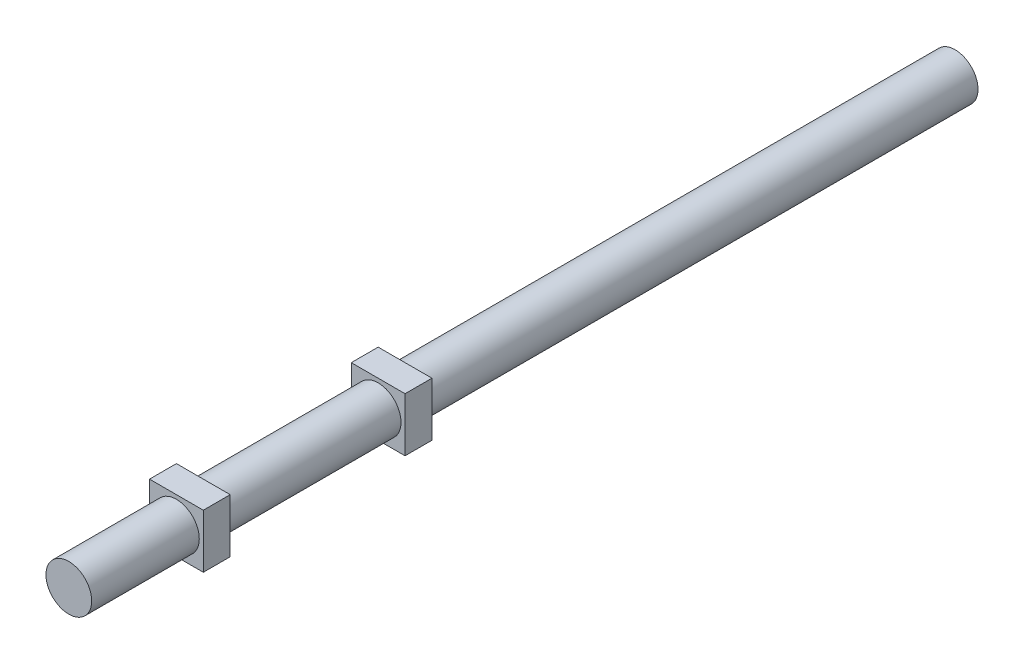
ISO-10303-21;
HEADER;
FILE_DESCRIPTION(('STEP AP214'),'2;1');
FILE_NAME('part.step','',(''),(''),'','','');
FILE_SCHEMA(('AUTOMOTIVE_DESIGN { 1 0 10303 214 1 1 1 1 }'));
ENDSEC;
DATA;
#1=APPLICATION_CONTEXT('core data for automotive mechanical design processes');
#2=APPLICATION_PROTOCOL_DEFINITION('international standard','automotive_design',2000,#1);
#3=PRODUCT_CONTEXT('',#1,'mechanical');
#4=PRODUCT('Part','Part','',(#3));
#5=PRODUCT_RELATED_PRODUCT_CATEGORY('part','',(#4));
#6=PRODUCT_DEFINITION_FORMATION('','',#4);
#7=PRODUCT_DEFINITION_CONTEXT('part definition',#1,'design');
#8=PRODUCT_DEFINITION('design','',#6,#7);
#9=PRODUCT_DEFINITION_SHAPE('','',#8);
#10=(LENGTH_UNIT() NAMED_UNIT(*) SI_UNIT(.MILLI.,.METRE.));
#11=(NAMED_UNIT(*) PLANE_ANGLE_UNIT() SI_UNIT($,.RADIAN.));
#12=(NAMED_UNIT(*) SI_UNIT($,.STERADIAN.) SOLID_ANGLE_UNIT());
#13=UNCERTAINTY_MEASURE_WITH_UNIT(LENGTH_MEASURE(1.E-05),#10,'distance_accuracy_value','');
#14=(GEOMETRIC_REPRESENTATION_CONTEXT(3) GLOBAL_UNCERTAINTY_ASSIGNED_CONTEXT((#13)) GLOBAL_UNIT_ASSIGNED_CONTEXT((#10,
#11,#12)) REPRESENTATION_CONTEXT('',''));
#15=CARTESIAN_POINT('',(0.,0.,0.));
#16=DIRECTION('',(0.,0.,1.));
#17=DIRECTION('',(1.,0.,0.));
#18=AXIS2_PLACEMENT_3D('',#15,#16,#17);
#19=CARTESIAN_POINT('',(0.,0.,329.5));
#20=DIRECTION('',(0.,0.,-1.));
#21=DIRECTION('',(-1.,0.,0.));
#22=AXIS2_PLACEMENT_3D('',#19,#20,#21);
#23=CYLINDRICAL_SURFACE('',#22,8.5);
#24=CARTESIAN_POINT('',(0.,0.,289.5));
#25=DIRECTION('',(0.,0.,1.));
#26=DIRECTION('',(1.,0.,0.));
#27=AXIS2_PLACEMENT_3D('',#24,#25,#26);
#28=CIRCLE('',#27,8.5);
#29=CARTESIAN_POINT('',(8.5,0.,289.5));
#30=VERTEX_POINT('',#29);
#31=EDGE_CURVE('E175',#30,#30,#28,.T.);
#32=ORIENTED_EDGE('',*,*,#31,.T.);
#33=EDGE_LOOP('',(#32));
#34=FACE_BOUND('',#33,.T.);
#35=CARTESIAN_POINT('',(0.,0.,329.5));
#36=DIRECTION('',(0.,0.,1.));
#37=DIRECTION('',(1.,0.,0.));
#38=AXIS2_PLACEMENT_3D('',#35,#36,#37);
#39=CIRCLE('',#38,8.5);
#40=CARTESIAN_POINT('',(8.5,0.,329.5));
#41=VERTEX_POINT('',#40);
#42=EDGE_CURVE('E176',#41,#41,#39,.T.);
#43=ORIENTED_EDGE('',*,*,#42,.F.);
#44=EDGE_LOOP('',(#43));
#45=FACE_BOUND('',#44,.T.);
#46=ADVANCED_FACE('F47',(#34,#45),#23,.T.);
#47=CARTESIAN_POINT('',(0.,0.,329.5));
#48=DIRECTION('',(0.,0.,1.));
#49=DIRECTION('',(1.,0.,0.));
#50=AXIS2_PLACEMENT_3D('',#47,#48,#49);
#51=PLANE('',#50);
#52=ORIENTED_EDGE('',*,*,#42,.T.);
#53=EDGE_LOOP('',(#52));
#54=FACE_BOUND('',#53,.T.);
#55=ADVANCED_FACE('F215',(#54),#51,.T.);
#56=CARTESIAN_POINT('',(10.,10.,289.5));
#57=DIRECTION('',(-1.,0.,0.));
#58=DIRECTION('',(0.,0.,1.));
#59=AXIS2_PLACEMENT_3D('',#56,#57,#58);
#60=PLANE('',#59);
#61=DIRECTION('',(0.,1.,0.));
#62=VECTOR('',#61,1.);
#63=CARTESIAN_POINT('',(10.,10.,279.5));
#64=LINE('',#63,#62);
#65=CARTESIAN_POINT('',(10.,-10.,279.5));
#66=VERTEX_POINT('',#65);
#67=CARTESIAN_POINT('',(10.,10.,279.5));
#68=VERTEX_POINT('',#67);
#69=EDGE_CURVE('E150',#66,#68,#64,.T.);
#70=ORIENTED_EDGE('',*,*,#69,.T.);
#71=DIRECTION('',(0.,0.,-1.));
#72=VECTOR('',#71,1.);
#73=CARTESIAN_POINT('',(10.,10.,289.5));
#74=LINE('',#73,#72);
#75=CARTESIAN_POINT('',(10.,10.,289.5));
#76=VERTEX_POINT('',#75);
#77=EDGE_CURVE('E173',#76,#68,#74,.T.);
#78=ORIENTED_EDGE('',*,*,#77,.F.);
#79=DIRECTION('',(0.,1.,0.));
#80=VECTOR('',#79,1.);
#81=CARTESIAN_POINT('',(10.,10.,289.5));
#82=LINE('',#81,#80);
#83=CARTESIAN_POINT('',(10.,-10.,289.5));
#84=VERTEX_POINT('',#83);
#85=EDGE_CURVE('E155',#84,#76,#82,.T.);
#86=ORIENTED_EDGE('',*,*,#85,.F.);
#87=DIRECTION('',(0.,0.,-1.));
#88=VECTOR('',#87,1.);
#89=CARTESIAN_POINT('',(10.,-10.,289.5));
#90=LINE('',#89,#88);
#91=EDGE_CURVE('E161',#84,#66,#90,.T.);
#92=ORIENTED_EDGE('',*,*,#91,.T.);
#93=EDGE_LOOP('',(#70,#78,#86,#92));
#94=FACE_BOUND('',#93,.T.);
#95=ADVANCED_FACE('F197',(#94),#60,.F.);
#96=CARTESIAN_POINT('',(-10.,10.,289.5));
#97=DIRECTION('',(0.,-1.,0.));
#98=DIRECTION('',(0.,0.,-1.));
#99=AXIS2_PLACEMENT_3D('',#96,#97,#98);
#100=PLANE('',#99);
#101=DIRECTION('',(-1.,0.,0.));
#102=VECTOR('',#101,1.);
#103=CARTESIAN_POINT('',(-10.,10.,279.5));
#104=LINE('',#103,#102);
#105=CARTESIAN_POINT('',(-10.,10.,279.5));
#106=VERTEX_POINT('',#105);
#107=EDGE_CURVE('E164',#68,#106,#104,.T.);
#108=ORIENTED_EDGE('',*,*,#107,.T.);
#109=DIRECTION('',(0.,0.,-1.));
#110=VECTOR('',#109,1.);
#111=CARTESIAN_POINT('',(-10.,10.,289.5));
#112=LINE('',#111,#110);
#113=CARTESIAN_POINT('',(-10.,10.,289.5));
#114=VERTEX_POINT('',#113);
#115=EDGE_CURVE('E171',#114,#106,#112,.T.);
#116=ORIENTED_EDGE('',*,*,#115,.F.);
#117=DIRECTION('',(-1.,0.,0.));
#118=VECTOR('',#117,1.);
#119=CARTESIAN_POINT('',(-10.,10.,289.5));
#120=LINE('',#119,#118);
#121=EDGE_CURVE('E96',#76,#114,#120,.T.);
#122=ORIENTED_EDGE('',*,*,#121,.F.);
#123=ORIENTED_EDGE('',*,*,#77,.T.);
#124=EDGE_LOOP('',(#108,#116,#122,#123));
#125=FACE_BOUND('',#124,.T.);
#126=ADVANCED_FACE('F199',(#125),#100,.F.);
#127=CARTESIAN_POINT('',(-10.,10.,289.5));
#128=DIRECTION('',(1.,0.,0.));
#129=DIRECTION('',(0.,1.,0.));
#130=AXIS2_PLACEMENT_3D('',#127,#128,#129);
#131=PLANE('',#130);
#132=DIRECTION('',(0.,-1.,0.));
#133=VECTOR('',#132,1.);
#134=CARTESIAN_POINT('',(-10.,10.,279.5));
#135=LINE('',#134,#133);
#136=CARTESIAN_POINT('',(-10.,-10.,279.5));
#137=VERTEX_POINT('',#136);
#138=EDGE_CURVE('E82',#106,#137,#135,.T.);
#139=ORIENTED_EDGE('',*,*,#138,.T.);
#140=DIRECTION('',(0.,0.,-1.));
#141=VECTOR('',#140,1.);
#142=CARTESIAN_POINT('',(-10.,-10.,289.5));
#143=LINE('',#142,#141);
#144=CARTESIAN_POINT('',(-10.,-10.,289.5));
#145=VERTEX_POINT('',#144);
#146=EDGE_CURVE('E169',#145,#137,#143,.T.);
#147=ORIENTED_EDGE('',*,*,#146,.F.);
#148=DIRECTION('',(0.,-1.,0.));
#149=VECTOR('',#148,1.);
#150=CARTESIAN_POINT('',(-10.,10.,289.5));
#151=LINE('',#150,#149);
#152=EDGE_CURVE('E158',#114,#145,#151,.T.);
#153=ORIENTED_EDGE('',*,*,#152,.F.);
#154=ORIENTED_EDGE('',*,*,#115,.T.);
#155=EDGE_LOOP('',(#139,#147,#153,#154));
#156=FACE_BOUND('',#155,.T.);
#157=ADVANCED_FACE('F202',(#156),#131,.F.);
#158=CARTESIAN_POINT('',(-10.,-10.,289.5));
#159=DIRECTION('',(0.,1.,0.));
#160=DIRECTION('',(0.,0.,1.));
#161=AXIS2_PLACEMENT_3D('',#158,#159,#160);
#162=PLANE('',#161);
#163=DIRECTION('',(1.,0.,0.));
#164=VECTOR('',#163,1.);
#165=CARTESIAN_POINT('',(-10.,-10.,279.5));
#166=LINE('',#165,#164);
#167=EDGE_CURVE('E88',#137,#66,#166,.T.);
#168=ORIENTED_EDGE('',*,*,#167,.T.);
#169=ORIENTED_EDGE('',*,*,#91,.F.);
#170=DIRECTION('',(1.,0.,0.));
#171=VECTOR('',#170,1.);
#172=CARTESIAN_POINT('',(-10.,-10.,289.5));
#173=LINE('',#172,#171);
#174=EDGE_CURVE('E64',#145,#84,#173,.T.);
#175=ORIENTED_EDGE('',*,*,#174,.F.);
#176=ORIENTED_EDGE('',*,*,#146,.T.);
#177=EDGE_LOOP('',(#168,#169,#175,#176));
#178=FACE_BOUND('',#177,.T.);
#179=ADVANCED_FACE('F192',(#178),#162,.F.);
#180=CARTESIAN_POINT('',(0.,0.,289.5));
#181=DIRECTION('',(0.,0.,1.));
#182=DIRECTION('',(1.,0.,0.));
#183=AXIS2_PLACEMENT_3D('',#180,#181,#182);
#184=PLANE('',#183);
#185=ORIENTED_EDGE('',*,*,#31,.F.);
#186=EDGE_LOOP('',(#185));
#187=FACE_BOUND('',#186,.T.);
#188=ORIENTED_EDGE('',*,*,#85,.T.);
#189=ORIENTED_EDGE('',*,*,#121,.T.);
#190=ORIENTED_EDGE('',*,*,#152,.T.);
#191=ORIENTED_EDGE('',*,*,#174,.T.);
#192=EDGE_LOOP('',(#188,#189,#190,#191));
#193=FACE_BOUND('',#192,.T.);
#194=ADVANCED_FACE('F189',(#187,#193),#184,.T.);
#195=CARTESIAN_POINT('',(0.,0.,279.5));
#196=DIRECTION('',(0.,0.,1.));
#197=DIRECTION('',(1.,0.,0.));
#198=AXIS2_PLACEMENT_3D('',#195,#196,#197);
#199=PLANE('',#198);
#200=CARTESIAN_POINT('',(0.,0.,279.5));
#201=DIRECTION('',(0.,0.,1.));
#202=DIRECTION('',(1.,0.,0.));
#203=AXIS2_PLACEMENT_3D('',#200,#201,#202);
#204=CIRCLE('',#203,8.5);
#205=CARTESIAN_POINT('',(8.5,0.,279.5));
#206=VERTEX_POINT('',#205);
#207=EDGE_CURVE('E56',#206,#206,#204,.T.);
#208=ORIENTED_EDGE('',*,*,#207,.T.);
#209=EDGE_LOOP('',(#208));
#210=FACE_BOUND('',#209,.T.);
#211=ORIENTED_EDGE('',*,*,#69,.F.);
#212=ORIENTED_EDGE('',*,*,#167,.F.);
#213=ORIENTED_EDGE('',*,*,#138,.F.);
#214=ORIENTED_EDGE('',*,*,#107,.F.);
#215=EDGE_LOOP('',(#211,#212,#213,#214));
#216=FACE_BOUND('',#215,.T.);
#217=ADVANCED_FACE('F191',(#210,#216),#199,.F.);
#218=CARTESIAN_POINT('',(0.,0.,214.5));
#219=DIRECTION('',(0.,0.,1.));
#220=DIRECTION('',(1.,0.,0.));
#221=AXIS2_PLACEMENT_3D('',#218,#219,#220);
#222=CIRCLE('',#221,8.5);
#223=CARTESIAN_POINT('',(8.5,0.,214.5));
#224=VERTEX_POINT('',#223);
#225=EDGE_CURVE('E50',#224,#224,#222,.T.);
#226=ORIENTED_EDGE('',*,*,#225,.T.);
#227=EDGE_LOOP('',(#226));
#228=FACE_BOUND('',#227,.T.);
#229=ORIENTED_EDGE('',*,*,#207,.F.);
#230=EDGE_LOOP('',(#229));
#231=FACE_BOUND('',#230,.T.);
#232=ADVANCED_FACE('F204',(#228,#231),#23,.T.);
#233=CARTESIAN_POINT('',(10.,10.,214.5));
#234=DIRECTION('',(-1.,0.,0.));
#235=DIRECTION('',(0.,0.,1.));
#236=AXIS2_PLACEMENT_3D('',#233,#234,#235);
#237=PLANE('',#236);
#238=DIRECTION('',(0.,1.,0.));
#239=VECTOR('',#238,1.);
#240=CARTESIAN_POINT('',(10.,10.,204.5));
#241=LINE('',#240,#239);
#242=CARTESIAN_POINT('',(10.,-10.,204.5));
#243=VERTEX_POINT('',#242);
#244=CARTESIAN_POINT('',(10.,10.,204.5));
#245=VERTEX_POINT('',#244);
#246=EDGE_CURVE('E147',#243,#245,#241,.T.);
#247=ORIENTED_EDGE('',*,*,#246,.T.);
#248=DIRECTION('',(0.,0.,-1.));
#249=VECTOR('',#248,1.);
#250=CARTESIAN_POINT('',(10.,10.,214.5));
#251=LINE('',#250,#249);
#252=CARTESIAN_POINT('',(10.,10.,214.5));
#253=VERTEX_POINT('',#252);
#254=EDGE_CURVE('E127',#253,#245,#251,.T.);
#255=ORIENTED_EDGE('',*,*,#254,.F.);
#256=DIRECTION('',(0.,1.,0.));
#257=VECTOR('',#256,1.);
#258=CARTESIAN_POINT('',(10.,10.,214.5));
#259=LINE('',#258,#257);
#260=CARTESIAN_POINT('',(10.,-10.,214.5));
#261=VERTEX_POINT('',#260);
#262=EDGE_CURVE('E134',#261,#253,#259,.T.);
#263=ORIENTED_EDGE('',*,*,#262,.F.);
#264=DIRECTION('',(0.,0.,-1.));
#265=VECTOR('',#264,1.);
#266=CARTESIAN_POINT('',(10.,-10.,214.5));
#267=LINE('',#266,#265);
#268=EDGE_CURVE('E249',#261,#243,#267,.T.);
#269=ORIENTED_EDGE('',*,*,#268,.T.);
#270=EDGE_LOOP('',(#247,#255,#263,#269));
#271=FACE_BOUND('',#270,.T.);
#272=ADVANCED_FACE('F145',(#271),#237,.F.);
#273=CARTESIAN_POINT('',(-10.,10.,214.5));
#274=DIRECTION('',(0.,-1.,0.));
#275=DIRECTION('',(0.,0.,-1.));
#276=AXIS2_PLACEMENT_3D('',#273,#274,#275);
#277=PLANE('',#276);
#278=DIRECTION('',(-1.,0.,0.));
#279=VECTOR('',#278,1.);
#280=CARTESIAN_POINT('',(-10.,10.,204.5));
#281=LINE('',#280,#279);
#282=CARTESIAN_POINT('',(-10.,10.,204.5));
#283=VERTEX_POINT('',#282);
#284=EDGE_CURVE('E240',#245,#283,#281,.T.);
#285=ORIENTED_EDGE('',*,*,#284,.T.);
#286=DIRECTION('',(0.,0.,-1.));
#287=VECTOR('',#286,1.);
#288=CARTESIAN_POINT('',(-10.,10.,214.5));
#289=LINE('',#288,#287);
#290=CARTESIAN_POINT('',(-10.,10.,214.5));
#291=VERTEX_POINT('',#290);
#292=EDGE_CURVE('E130',#291,#283,#289,.T.);
#293=ORIENTED_EDGE('',*,*,#292,.F.);
#294=DIRECTION('',(-1.,0.,0.));
#295=VECTOR('',#294,1.);
#296=CARTESIAN_POINT('',(-10.,10.,214.5));
#297=LINE('',#296,#295);
#298=EDGE_CURVE('E123',#253,#291,#297,.T.);
#299=ORIENTED_EDGE('',*,*,#298,.F.);
#300=ORIENTED_EDGE('',*,*,#254,.T.);
#301=EDGE_LOOP('',(#285,#293,#299,#300));
#302=FACE_BOUND('',#301,.T.);
#303=ADVANCED_FACE('F125',(#302),#277,.F.);
#304=CARTESIAN_POINT('',(-10.,10.,214.5));
#305=DIRECTION('',(1.,0.,0.));
#306=DIRECTION('',(0.,0.,-1.));
#307=AXIS2_PLACEMENT_3D('',#304,#305,#306);
#308=PLANE('',#307);
#309=DIRECTION('',(0.,-1.,0.));
#310=VECTOR('',#309,1.);
#311=CARTESIAN_POINT('',(-10.,10.,204.5));
#312=LINE('',#311,#310);
#313=CARTESIAN_POINT('',(-10.,-10.,204.5));
#314=VERTEX_POINT('',#313);
#315=EDGE_CURVE('E242',#283,#314,#312,.T.);
#316=ORIENTED_EDGE('',*,*,#315,.T.);
#317=DIRECTION('',(0.,0.,-1.));
#318=VECTOR('',#317,1.);
#319=CARTESIAN_POINT('',(-10.,-10.,214.5));
#320=LINE('',#319,#318);
#321=CARTESIAN_POINT('',(-10.,-10.,214.5));
#322=VERTEX_POINT('',#321);
#323=EDGE_CURVE('E151',#322,#314,#320,.T.);
#324=ORIENTED_EDGE('',*,*,#323,.F.);
#325=DIRECTION('',(0.,-1.,0.));
#326=VECTOR('',#325,1.);
#327=CARTESIAN_POINT('',(-10.,10.,214.5));
#328=LINE('',#327,#326);
#329=EDGE_CURVE('E133',#291,#322,#328,.T.);
#330=ORIENTED_EDGE('',*,*,#329,.F.);
#331=ORIENTED_EDGE('',*,*,#292,.T.);
#332=EDGE_LOOP('',(#316,#324,#330,#331));
#333=FACE_BOUND('',#332,.T.);
#334=ADVANCED_FACE('F255',(#333),#308,.F.);
#335=CARTESIAN_POINT('',(-10.,-10.,214.5));
#336=DIRECTION('',(0.,1.,0.));
#337=DIRECTION('',(0.,0.,1.));
#338=AXIS2_PLACEMENT_3D('',#335,#336,#337);
#339=PLANE('',#338);
#340=DIRECTION('',(1.,0.,0.));
#341=VECTOR('',#340,1.);
#342=CARTESIAN_POINT('',(-10.,-10.,204.5));
#343=LINE('',#342,#341);
#344=EDGE_CURVE('E143',#314,#243,#343,.T.);
#345=ORIENTED_EDGE('',*,*,#344,.T.);
#346=ORIENTED_EDGE('',*,*,#268,.F.);
#347=DIRECTION('',(1.,0.,0.));
#348=VECTOR('',#347,1.);
#349=CARTESIAN_POINT('',(-10.,-10.,214.5));
#350=LINE('',#349,#348);
#351=EDGE_CURVE('E139',#322,#261,#350,.T.);
#352=ORIENTED_EDGE('',*,*,#351,.F.);
#353=ORIENTED_EDGE('',*,*,#323,.T.);
#354=EDGE_LOOP('',(#345,#346,#352,#353));
#355=FACE_BOUND('',#354,.T.);
#356=ADVANCED_FACE('F253',(#355),#339,.F.);
#357=CARTESIAN_POINT('',(0.,0.,214.5));
#358=DIRECTION('',(0.,0.,1.));
#359=DIRECTION('',(1.,0.,0.));
#360=AXIS2_PLACEMENT_3D('',#357,#358,#359);
#361=PLANE('',#360);
#362=ORIENTED_EDGE('',*,*,#225,.F.);
#363=EDGE_LOOP('',(#362));
#364=FACE_BOUND('',#363,.T.);
#365=ORIENTED_EDGE('',*,*,#262,.T.);
#366=ORIENTED_EDGE('',*,*,#298,.T.);
#367=ORIENTED_EDGE('',*,*,#329,.T.);
#368=ORIENTED_EDGE('',*,*,#351,.T.);
#369=EDGE_LOOP('',(#365,#366,#367,#368));
#370=FACE_BOUND('',#369,.T.);
#371=ADVANCED_FACE('F137',(#364,#370),#361,.T.);
#372=CARTESIAN_POINT('',(0.,0.,204.5));
#373=DIRECTION('',(0.,0.,1.));
#374=DIRECTION('',(1.,0.,0.));
#375=AXIS2_PLACEMENT_3D('',#372,#373,#374);
#376=PLANE('',#375);
#377=CARTESIAN_POINT('',(0.,0.,204.5));
#378=DIRECTION('',(0.,0.,1.));
#379=DIRECTION('',(1.,0.,0.));
#380=AXIS2_PLACEMENT_3D('',#377,#378,#379);
#381=CIRCLE('',#380,8.5);
#382=CARTESIAN_POINT('',(8.5,0.,204.5));
#383=VERTEX_POINT('',#382);
#384=EDGE_CURVE('E11',#383,#383,#381,.T.);
#385=ORIENTED_EDGE('',*,*,#384,.T.);
#386=EDGE_LOOP('',(#385));
#387=FACE_BOUND('',#386,.T.);
#388=ORIENTED_EDGE('',*,*,#246,.F.);
#389=ORIENTED_EDGE('',*,*,#344,.F.);
#390=ORIENTED_EDGE('',*,*,#315,.F.);
#391=ORIENTED_EDGE('',*,*,#284,.F.);
#392=EDGE_LOOP('',(#388,#389,#390,#391));
#393=FACE_BOUND('',#392,.T.);
#394=ADVANCED_FACE('F229',(#387,#393),#376,.F.);
#395=CARTESIAN_POINT('',(0.,0.,0.));
#396=DIRECTION('',(0.,0.,1.));
#397=DIRECTION('',(1.,0.,0.));
#398=AXIS2_PLACEMENT_3D('',#395,#396,#397);
#399=PLANE('',#398);
#400=CARTESIAN_POINT('',(0.,0.,0.));
#401=DIRECTION('',(0.,0.,1.));
#402=DIRECTION('',(1.,0.,0.));
#403=AXIS2_PLACEMENT_3D('',#400,#401,#402);
#404=CIRCLE('',#403,8.5);
#405=CARTESIAN_POINT('',(8.5,0.,0.));
#406=VERTEX_POINT('',#405);
#407=EDGE_CURVE('E179',#406,#406,#404,.T.);
#408=ORIENTED_EDGE('',*,*,#407,.F.);
#409=EDGE_LOOP('',(#408));
#410=FACE_BOUND('',#409,.T.);
#411=ADVANCED_FACE('F224',(#410),#399,.F.);
#412=ORIENTED_EDGE('',*,*,#407,.T.);
#413=EDGE_LOOP('',(#412));
#414=FACE_BOUND('',#413,.T.);
#415=ORIENTED_EDGE('',*,*,#384,.F.);
#416=EDGE_LOOP('',(#415));
#417=FACE_BOUND('',#416,.T.);
#418=ADVANCED_FACE('F212',(#414,#417),#23,.T.);
#419=CLOSED_SHELL('',(#46,#55,#95,#126,#157,#179,#194,#217,#232,#272,#303,#334,#356,#371,#394,
#411,#418));
#420=MANIFOLD_SOLID_BREP('B2',#419);
#421=ADVANCED_BREP_SHAPE_REPRESENTATION('',(#18,#420),#14);
#422=SHAPE_DEFINITION_REPRESENTATION(#9,#421);
ENDSEC;
END-ISO-10303-21;
